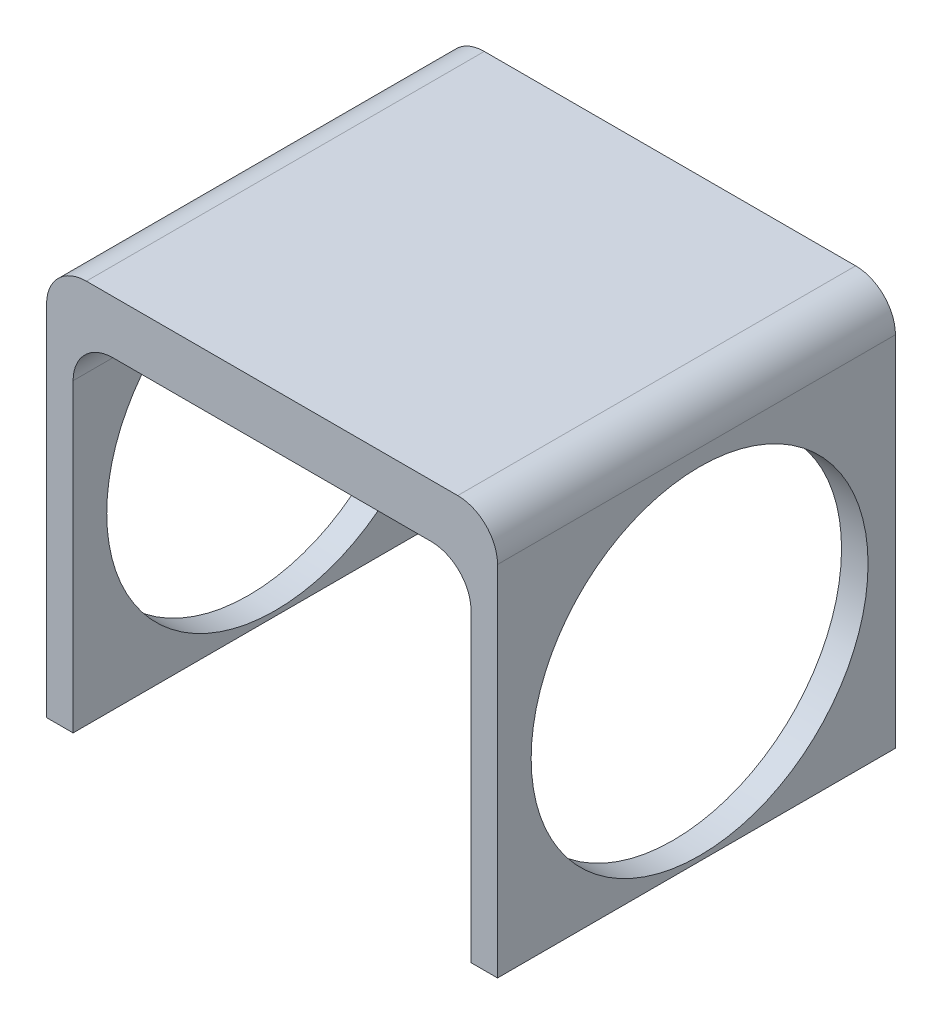
ISO-10303-21;
HEADER;
FILE_DESCRIPTION(('STEP AP214'),'2;1');
FILE_NAME('part.step','',(''),(''),'','','');
FILE_SCHEMA(('AUTOMOTIVE_DESIGN { 1 0 10303 214 1 1 1 1 }'));
ENDSEC;
DATA;
#1=APPLICATION_CONTEXT('core data for automotive mechanical design processes');
#2=APPLICATION_PROTOCOL_DEFINITION('international standard','automotive_design',2000,#1);
#3=PRODUCT_CONTEXT('',#1,'mechanical');
#4=PRODUCT('Part','Part','',(#3));
#5=PRODUCT_RELATED_PRODUCT_CATEGORY('part','',(#4));
#6=PRODUCT_DEFINITION_FORMATION('','',#4);
#7=PRODUCT_DEFINITION_CONTEXT('part definition',#1,'design');
#8=PRODUCT_DEFINITION('design','',#6,#7);
#9=PRODUCT_DEFINITION_SHAPE('','',#8);
#10=(LENGTH_UNIT() NAMED_UNIT(*) SI_UNIT(.MILLI.,.METRE.));
#11=(NAMED_UNIT(*) PLANE_ANGLE_UNIT() SI_UNIT($,.RADIAN.));
#12=(NAMED_UNIT(*) SI_UNIT($,.STERADIAN.) SOLID_ANGLE_UNIT());
#13=UNCERTAINTY_MEASURE_WITH_UNIT(LENGTH_MEASURE(1.E-05),#10,'distance_accuracy_value','');
#14=(GEOMETRIC_REPRESENTATION_CONTEXT(3) GLOBAL_UNCERTAINTY_ASSIGNED_CONTEXT((#13)) GLOBAL_UNIT_ASSIGNED_CONTEXT((#10,
#11,#12)) REPRESENTATION_CONTEXT('',''));
#15=CARTESIAN_POINT('',(0.,0.,0.));
#16=DIRECTION('',(0.,0.,1.));
#17=DIRECTION('',(1.,0.,0.));
#18=AXIS2_PLACEMENT_3D('',#15,#16,#17);
#19=CARTESIAN_POINT('',(2.00000000000001,0.,30.));
#20=DIRECTION('',(0.,1.,0.));
#21=DIRECTION('',(-1.,0.,0.));
#22=AXIS2_PLACEMENT_3D('',#19,#20,#21);
#23=PLANE('',#22);
#24=DIRECTION('',(1.,0.,0.));
#25=VECTOR('',#24,1.);
#26=CARTESIAN_POINT('',(2.00000000000001,0.,0.));
#27=LINE('',#26,#25);
#28=CARTESIAN_POINT('',(0.,0.,0.));
#29=VERTEX_POINT('',#28);
#30=CARTESIAN_POINT('',(2.00000000000001,0.,0.));
#31=VERTEX_POINT('',#30);
#32=EDGE_CURVE('E211',#29,#31,#27,.T.);
#33=ORIENTED_EDGE('',*,*,#32,.T.);
#34=DIRECTION('',(0.,0.,-1.));
#35=VECTOR('',#34,1.);
#36=CARTESIAN_POINT('',(2.00000000000001,0.,30.));
#37=LINE('',#36,#35);
#38=CARTESIAN_POINT('',(2.00000000000001,0.,30.));
#39=VERTEX_POINT('',#38);
#40=EDGE_CURVE('E46',#39,#31,#37,.T.);
#41=ORIENTED_EDGE('',*,*,#40,.F.);
#42=DIRECTION('',(1.,0.,0.));
#43=VECTOR('',#42,1.);
#44=CARTESIAN_POINT('',(2.00000000000001,0.,30.));
#45=LINE('',#44,#43);
#46=CARTESIAN_POINT('',(0.,0.,30.));
#47=VERTEX_POINT('',#46);
#48=EDGE_CURVE('E189',#47,#39,#45,.T.);
#49=ORIENTED_EDGE('',*,*,#48,.F.);
#50=DIRECTION('',(0.,0.,-1.));
#51=VECTOR('',#50,1.);
#52=CARTESIAN_POINT('',(0.,0.,30.));
#53=LINE('',#52,#51);
#54=EDGE_CURVE('E183',#47,#29,#53,.T.);
#55=ORIENTED_EDGE('',*,*,#54,.T.);
#56=EDGE_LOOP('',(#33,#41,#49,#55));
#57=FACE_BOUND('',#56,.T.);
#58=ADVANCED_FACE('F33',(#57),#23,.F.);
#59=CARTESIAN_POINT('',(2.00000000000001,23.,30.));
#60=DIRECTION('',(-1.,0.,0.));
#61=DIRECTION('',(0.,-1.,0.));
#62=AXIS2_PLACEMENT_3D('',#59,#60,#61);
#63=PLANE('',#62);
#64=DIRECTION('',(0.,0.,-1.));
#65=VECTOR('',#64,1.);
#66=CARTESIAN_POINT('',(2.00000000000001,23.,30.));
#67=LINE('',#66,#65);
#68=CARTESIAN_POINT('',(2.00000000000001,23.,6.85029164252489));
#69=VERTEX_POINT('',#68);
#70=CARTESIAN_POINT('',(2.00000000000001,23.,0.));
#71=VERTEX_POINT('',#70);
#72=EDGE_CURVE('E145',#69,#71,#67,.T.);
#73=ORIENTED_EDGE('',*,*,#72,.F.);
#74=CARTESIAN_POINT('',(2.00000000000001,13.0671288351981,14.764081532549));
#75=DIRECTION('',(-1.,0.,0.));
#76=DIRECTION('',(0.,-1.,0.));
#77=AXIS2_PLACEMENT_3D('',#74,#75,#76);
#78=CIRCLE('',#77,12.7);
#79=CARTESIAN_POINT('',(2.00000000000001,23.,22.677871422573));
#80=VERTEX_POINT('',#79);
#81=EDGE_CURVE('E59',#69,#80,#78,.T.);
#82=ORIENTED_EDGE('',*,*,#81,.T.);
#83=CARTESIAN_POINT('',(2.00000000000001,23.,30.));
#84=VERTEX_POINT('',#83);
#85=EDGE_CURVE('E142',#84,#80,#67,.T.);
#86=ORIENTED_EDGE('',*,*,#85,.F.);
#87=DIRECTION('',(0.,1.,0.));
#88=VECTOR('',#87,1.);
#89=CARTESIAN_POINT('',(2.00000000000001,23.,30.));
#90=LINE('',#89,#88);
#91=EDGE_CURVE('E232',#39,#84,#90,.T.);
#92=ORIENTED_EDGE('',*,*,#91,.F.);
#93=ORIENTED_EDGE('',*,*,#40,.T.);
#94=DIRECTION('',(0.,1.,0.));
#95=VECTOR('',#94,1.);
#96=CARTESIAN_POINT('',(2.00000000000001,23.,0.));
#97=LINE('',#96,#95);
#98=EDGE_CURVE('E209',#31,#71,#97,.T.);
#99=ORIENTED_EDGE('',*,*,#98,.T.);
#100=EDGE_LOOP('',(#73,#82,#86,#92,#93,#99));
#101=FACE_BOUND('',#100,.T.);
#102=ADVANCED_FACE('F141',(#101),#63,.F.);
#103=CARTESIAN_POINT('',(5.00000000000001,23.,30.));
#104=DIRECTION('',(0.,0.,-1.));
#105=DIRECTION('',(-1.,0.,0.));
#106=AXIS2_PLACEMENT_3D('',#103,#104,#105);
#107=CYLINDRICAL_SURFACE('',#106,3.);
#108=ORIENTED_EDGE('',*,*,#85,.T.);
#109=CARTESIAN_POINT('',(2.00000000000001,23.,22.677871422573));
#110=CARTESIAN_POINT('',(2.00000541370947,23.067660819774,22.5929508145775));
#111=CARTESIAN_POINT('',(2.00228824975899,23.1342124315426,22.5071818236274));
#112=CARTESIAN_POINT('',(2.01100593425374,23.2649785872917,22.3341284160475));
#113=CARTESIAN_POINT('',(2.01743942183496,23.3291938899851,22.2468445052349));
#114=CARTESIAN_POINT('',(2.04233021190704,23.5179632702162,21.9832704104195));
#115=CARTESIAN_POINT('',(2.06638120705584,23.6389203292734,21.8049067553971));
#116=CARTESIAN_POINT('',(2.12629637729784,23.8693926991584,21.4458567447877));
#117=CARTESIAN_POINT('',(2.16202327247059,23.9790223636098,21.2652197817096));
#118=CARTESIAN_POINT('',(2.24311014728509,24.1883419247923,20.900277368607));
#119=CARTESIAN_POINT('',(2.28847592467472,24.2880257858925,20.7159697714506));
#120=CARTESIAN_POINT('',(2.41955964060307,24.5404315655292,20.220635970013));
#121=CARTESIAN_POINT('',(2.51204433944513,24.6843190290325,19.906880173368));
#122=CARTESIAN_POINT('',(2.71011156321414,24.9450343141579,19.2722144305041));
#123=CARTESIAN_POINT('',(2.81570358651893,25.0618423344894,18.9512994360596));
#124=CARTESIAN_POINT('',(2.97802223674495,25.2174968888046,18.4637950656446));
#125=CARTESIAN_POINT('',(3.03297596879829,25.2662534070856,18.2997066956016));
#126=CARTESIAN_POINT('',(3.14281604204161,25.3571039517056,17.9696726137882));
#127=CARTESIAN_POINT('',(3.19770238706131,25.399198375879,17.8037270135584));
#128=CARTESIAN_POINT('',(3.30579983907373,25.4767121365326,17.4699225119623));
#129=CARTESIAN_POINT('',(3.35901247028151,25.5121377019628,17.3020655528821));
#130=CARTESIAN_POINT('',(3.4617718083689,25.576338238378,16.9639230194869));
#131=CARTESIAN_POINT('',(3.51131798477014,25.6051122482615,16.7936370979738));
#132=CARTESIAN_POINT('',(3.59914022209814,25.6532693497467,16.4679852743152));
#133=CARTESIAN_POINT('',(3.63805160195516,25.6733148757526,16.3128917007565));
#134=CARTESIAN_POINT('',(3.70795556076649,25.7077930055785,16.0003305089221));
#135=CARTESIAN_POINT('',(3.73895149319939,25.7222279877334,15.8428639260456));
#136=CARTESIAN_POINT('',(3.78965766094144,25.7451504597433,15.5273075021446));
#137=CARTESIAN_POINT('',(3.80948146700143,25.7536980044883,15.3692410107624));
#138=CARTESIAN_POINT('',(3.83562979397381,25.7648615009213,15.0517940326834));
#139=CARTESIAN_POINT('',(3.84195972295349,25.767479828943,14.8924140981067));
#140=CARTESIAN_POINT('',(3.84009908411382,25.766700202207,14.5729417714857));
#141=CARTESIAN_POINT('',(3.83183403067035,25.7632713859072,14.4128499081166));
#142=CARTESIAN_POINT('',(3.80197345352201,25.7504508562347,14.0941480983059));
#143=CARTESIAN_POINT('',(3.7803720283968,25.7410565030254,13.9355388394842));
#144=CARTESIAN_POINT('',(3.72641306117898,25.7164043756015,13.61895189675));
#145=CARTESIAN_POINT('',(3.69394390754744,25.7010854915638,13.4609987381131));
#146=CARTESIAN_POINT('',(3.62143054914372,25.664805459355,13.1474585177539));
#147=CARTESIAN_POINT('',(3.58138226373542,25.6438412691443,12.9918727796407));
#148=CARTESIAN_POINT('',(3.49136221588351,25.5936397086996,12.6647896279849));
#149=CARTESIAN_POINT('',(3.44077741577934,25.5637200285162,12.4935684801339));
#150=CARTESIAN_POINT('',(3.3362208086655,25.497135586202,12.153537842454));
#151=CARTESIAN_POINT('',(3.28224947790962,25.4604717711164,11.9847280175974));
#152=CARTESIAN_POINT('',(3.17287302099301,25.3803797562367,11.6490122591385));
#153=CARTESIAN_POINT('',(3.11746663037223,25.3369454091466,11.4821082051557));
#154=CARTESIAN_POINT('',(3.00680117824302,25.2433056747543,11.1501570919265));
#155=CARTESIAN_POINT('',(2.95154212921036,25.1930997315565,10.9851101863441));
#156=CARTESIAN_POINT('',(2.78867882280629,25.0330021111079,10.4949419008708));
#157=CARTESIAN_POINT('',(2.68314958082455,24.9130458544895,10.1723421122895));
#158=CARTESIAN_POINT('',(2.48610441139467,24.6455905295606,9.53449303045939));
#159=CARTESIAN_POINT('',(2.39457757472188,24.4981131038155,9.21923817881462));
#160=CARTESIAN_POINT('',(2.2681924239423,24.2441385281983,8.73045253549048));
#161=CARTESIAN_POINT('',(2.22583339710372,24.147066762278,8.55393753538349));
#162=CARTESIAN_POINT('',(2.15024706543519,23.9437534216515,8.20436403441391));
#163=CARTESIAN_POINT('',(2.1170145444787,23.8375171306215,8.0313036118073));
#164=CARTESIAN_POINT('',(2.06138412676863,23.6147085962387,7.6872887702241));
#165=CARTESIAN_POINT('',(2.03911095745659,23.498034459268,7.51637924023877));
#166=CARTESIAN_POINT('',(2.01609366641987,23.3162892809991,7.26371419599659));
#167=CARTESIAN_POINT('',(2.01015262330487,23.2545232264513,7.18003118191206));
#168=CARTESIAN_POINT('',(2.00210752670161,23.1288453771716,7.01406828546004));
#169=CARTESIAN_POINT('',(2.00000460424254,23.0649329555902,6.93178882376953));
#170=CARTESIAN_POINT('',(2.,23.,6.85029164252489));
#171=B_SPLINE_CURVE_WITH_KNOTS('',3,(#109,#110,#111,#112,#113,#114,#115,#116,#117,#118,#119,
#120,#121,#122,#123,#124,#125,#126,#127,#128,#129,#130,#131,#132,#133,#134,#135,#136,#137,#138,
#139,#140,#141,#142,#143,#144,#145,#146,#147,#148,#149,#150,#151,#152,#153,#154,#155,#156,#157,
#158,#159,#160,#161,#162,#163,#164,#165,#166,#167,#168,#169,#170),.UNSPECIFIED.,.F.,.F.,(4,2,2,
2,2,2,2,2,2,2,2,2,2,2,2,2,2,2,2,2,2,2,2,2,2,2,2,2,2,2,4),(0.,0.325659882711964,
0.651213046335516,1.30097780041144,1.94336236111868,2.58613441292052,3.65652814599402,
4.72770213109706,5.2669457057586,5.80615706673649,6.34486225881106,6.88364524128184,
7.36686610280958,7.84988190084406,8.32789466677231,8.80571581900975,9.28598258818869,
9.76646203061891,10.2520356672187,10.7378714863091,11.2807419682606,11.8235362757449,
12.3668263144587,12.9101609802423,13.9888853278751,15.0667649176397,15.6839519245499,
16.3007854492668,16.9244854679799,17.2369307571228,17.5494681037467),.UNSPECIFIED.);
#172=EDGE_CURVE('E11',#80,#69,#171,.T.);
#173=ORIENTED_EDGE('',*,*,#172,.T.);
#174=ORIENTED_EDGE('',*,*,#72,.T.);
#175=CARTESIAN_POINT('',(5.00000000000001,23.,0.));
#176=DIRECTION('',(0.,0.,-1.));
#177=DIRECTION('',(1.,0.,0.));
#178=AXIS2_PLACEMENT_3D('',#175,#176,#177);
#179=CIRCLE('',#178,3.);
#180=CARTESIAN_POINT('',(5.00000000000003,26.,0.));
#181=VERTEX_POINT('',#180);
#182=EDGE_CURVE('E207',#71,#181,#179,.T.);
#183=ORIENTED_EDGE('',*,*,#182,.T.);
#184=DIRECTION('',(0.,0.,-1.));
#185=VECTOR('',#184,1.);
#186=CARTESIAN_POINT('',(5.00000000000003,26.,30.));
#187=LINE('',#186,#185);
#188=CARTESIAN_POINT('',(5.00000000000003,26.,30.));
#189=VERTEX_POINT('',#188);
#190=EDGE_CURVE('E154',#189,#181,#187,.T.);
#191=ORIENTED_EDGE('',*,*,#190,.F.);
#192=CARTESIAN_POINT('',(5.00000000000001,23.,30.));
#193=DIRECTION('',(0.,0.,-1.));
#194=DIRECTION('',(1.,0.,0.));
#195=AXIS2_PLACEMENT_3D('',#192,#193,#194);
#196=CIRCLE('',#195,3.);
#197=EDGE_CURVE('E151',#84,#189,#196,.T.);
#198=ORIENTED_EDGE('',*,*,#197,.F.);
#199=EDGE_LOOP('',(#108,#173,#174,#183,#191,#198));
#200=FACE_BOUND('',#199,.T.);
#201=ADVANCED_FACE('F149',(#200),#107,.F.);
#202=CARTESIAN_POINT('',(29.,26.,30.));
#203=DIRECTION('',(0.,1.,0.));
#204=DIRECTION('',(-1.,0.,0.));
#205=AXIS2_PLACEMENT_3D('',#202,#203,#204);
#206=PLANE('',#205);
#207=DIRECTION('',(1.,0.,0.));
#208=VECTOR('',#207,1.);
#209=CARTESIAN_POINT('',(29.,26.,0.));
#210=LINE('',#209,#208);
#211=CARTESIAN_POINT('',(29.,26.,0.));
#212=VERTEX_POINT('',#211);
#213=EDGE_CURVE('E205',#181,#212,#210,.T.);
#214=ORIENTED_EDGE('',*,*,#213,.T.);
#215=DIRECTION('',(0.,0.,-1.));
#216=VECTOR('',#215,1.);
#217=CARTESIAN_POINT('',(29.,26.,30.));
#218=LINE('',#217,#216);
#219=CARTESIAN_POINT('',(29.,26.,30.));
#220=VERTEX_POINT('',#219);
#221=EDGE_CURVE('E158',#220,#212,#218,.T.);
#222=ORIENTED_EDGE('',*,*,#221,.F.);
#223=DIRECTION('',(1.,0.,0.));
#224=VECTOR('',#223,1.);
#225=CARTESIAN_POINT('',(29.,26.,30.));
#226=LINE('',#225,#224);
#227=EDGE_CURVE('E229',#189,#220,#226,.T.);
#228=ORIENTED_EDGE('',*,*,#227,.F.);
#229=ORIENTED_EDGE('',*,*,#190,.T.);
#230=EDGE_LOOP('',(#214,#222,#228,#229));
#231=FACE_BOUND('',#230,.T.);
#232=ADVANCED_FACE('F290',(#231),#206,.F.);
#233=CARTESIAN_POINT('',(29.,23.,30.));
#234=DIRECTION('',(0.,0.,-1.));
#235=DIRECTION('',(-1.,0.,0.));
#236=AXIS2_PLACEMENT_3D('',#233,#234,#235);
#237=CYLINDRICAL_SURFACE('',#236,3.);
#238=DIRECTION('',(0.,0.,-1.));
#239=VECTOR('',#238,1.);
#240=CARTESIAN_POINT('',(32.,23.,30.));
#241=LINE('',#240,#239);
#242=CARTESIAN_POINT('',(32.,23.,6.85029164252492));
#243=VERTEX_POINT('',#242);
#244=CARTESIAN_POINT('',(32.,23.,0.));
#245=VERTEX_POINT('',#244);
#246=EDGE_CURVE('E164',#243,#245,#241,.T.);
#247=ORIENTED_EDGE('',*,*,#246,.F.);
#248=CARTESIAN_POINT('',(32.,23.,6.85029164252492));
#249=CARTESIAN_POINT('',(31.9999945862905,23.067660819774,6.93521225052049));
#250=CARTESIAN_POINT('',(31.997711750241,23.1342124315426,7.02098124147053));
#251=CARTESIAN_POINT('',(31.9889940657463,23.2649785872918,7.19403464905041));
#252=CARTESIAN_POINT('',(31.982560578165,23.3291938899851,7.28131855986309));
#253=CARTESIAN_POINT('',(31.957669788093,23.5179632702162,7.54489265467843));
#254=CARTESIAN_POINT('',(31.9336187929442,23.6389203292735,7.72325630970086));
#255=CARTESIAN_POINT('',(31.8737036227022,23.8693926991584,8.08230632031025));
#256=CARTESIAN_POINT('',(31.8379767275294,23.9790223636098,8.26294328338841));
#257=CARTESIAN_POINT('',(31.7568898527149,24.1883419247923,8.62788569649102));
#258=CARTESIAN_POINT('',(31.7115240753253,24.2880257858925,8.81219329364738));
#259=CARTESIAN_POINT('',(31.5804403593969,24.5404315655292,9.30752709508493));
#260=CARTESIAN_POINT('',(31.4879556605549,24.6843190290325,9.62128289173));
#261=CARTESIAN_POINT('',(31.2898884367859,24.9450343141579,10.2559486345939));
#262=CARTESIAN_POINT('',(31.1842964134811,25.0618423344894,10.5768636290384));
#263=CARTESIAN_POINT('',(31.021977763255,25.2174968888046,11.0643679994534));
#264=CARTESIAN_POINT('',(30.9670240312017,25.2662534070856,11.2284563694964));
#265=CARTESIAN_POINT('',(30.8571839579584,25.3571039517057,11.5584904513098));
#266=CARTESIAN_POINT('',(30.8022976129387,25.399198375879,11.7244360515396));
#267=CARTESIAN_POINT('',(30.6942001609263,25.4767121365326,12.0582405531357));
#268=CARTESIAN_POINT('',(30.6409875297185,25.5121377019628,12.2260975122159));
#269=CARTESIAN_POINT('',(30.5382281916311,25.576338238378,12.5642400456111));
#270=CARTESIAN_POINT('',(30.4886820152299,25.6051122482615,12.7345259671242));
#271=CARTESIAN_POINT('',(30.4008597779019,25.6532693497467,13.0601777907829));
#272=CARTESIAN_POINT('',(30.3619483980448,25.6733148757526,13.2152713643415));
#273=CARTESIAN_POINT('',(30.2920444392335,25.7077930055785,13.5278325561758));
#274=CARTESIAN_POINT('',(30.2610485068006,25.7222279877334,13.6852991390524));
#275=CARTESIAN_POINT('',(30.2103423390586,25.7451504597433,14.0008555629534));
#276=CARTESIAN_POINT('',(30.1905185329986,25.7536980044883,14.1589220543356));
#277=CARTESIAN_POINT('',(30.1643702060262,25.7648615009212,14.4763690324145));
#278=CARTESIAN_POINT('',(30.1580402770465,25.767479828943,14.6357489669912));
#279=CARTESIAN_POINT('',(30.1599009158862,25.766700202207,14.9552212936122));
#280=CARTESIAN_POINT('',(30.1681659693297,25.7632713859072,15.1153131569813));
#281=CARTESIAN_POINT('',(30.198026546478,25.7504508562347,15.4340149667919));
#282=CARTESIAN_POINT('',(30.2196279716032,25.7410565030254,15.5926242256136));
#283=CARTESIAN_POINT('',(30.273586938821,25.7164043756015,15.9092111683478));
#284=CARTESIAN_POINT('',(30.3060560924526,25.7010854915638,16.0671643269847));
#285=CARTESIAN_POINT('',(30.3785694508563,25.664805459355,16.3807045473439));
#286=CARTESIAN_POINT('',(30.4186177362646,25.6438412691443,16.5362902854571));
#287=CARTESIAN_POINT('',(30.5086377841165,25.5936397086997,16.8633734371128));
#288=CARTESIAN_POINT('',(30.5592225842206,25.5637200285162,17.0345945849639));
#289=CARTESIAN_POINT('',(30.6637791913345,25.4971355862021,17.3746252226438));
#290=CARTESIAN_POINT('',(30.7177505220904,25.4604717711165,17.5434350475003));
#291=CARTESIAN_POINT('',(30.827126979007,25.3803797562367,17.8791508059593));
#292=CARTESIAN_POINT('',(30.8825333696277,25.3369454091466,18.0460548599421));
#293=CARTESIAN_POINT('',(30.9931988217569,25.2433056747543,18.3780059731712));
#294=CARTESIAN_POINT('',(31.0484578707896,25.1930997315566,18.5430528787536));
#295=CARTESIAN_POINT('',(31.2113211771937,25.033002111108,19.0332211642269));
#296=CARTESIAN_POINT('',(31.3168504191754,24.9130458544896,19.3558209528083));
#297=CARTESIAN_POINT('',(31.5138955886053,24.6455905295606,19.9936700346384));
#298=CARTESIAN_POINT('',(31.6054224252781,24.4981131038155,20.3089248862831));
#299=CARTESIAN_POINT('',(31.7318075760577,24.2441385281984,20.7977105296073));
#300=CARTESIAN_POINT('',(31.7741666028963,24.1470667622781,20.9742255297143));
#301=CARTESIAN_POINT('',(31.8497529345648,23.9437534216516,21.3237990306839));
#302=CARTESIAN_POINT('',(31.8829854555213,23.8375171306215,21.4968594532905));
#303=CARTESIAN_POINT('',(31.9386158732314,23.6147085962388,21.8408742948737));
#304=CARTESIAN_POINT('',(31.9608890425434,23.4980344592681,22.0117838248591));
#305=CARTESIAN_POINT('',(31.9839063335801,23.3162892809992,22.2644488691013));
#306=CARTESIAN_POINT('',(31.9898473766951,23.2545232264514,22.3481318831858));
#307=CARTESIAN_POINT('',(31.9978924732984,23.1288453771716,22.5140947796378));
#308=CARTESIAN_POINT('',(31.9999953957575,23.0649329555902,22.5963742413283));
#309=CARTESIAN_POINT('',(32.,23.,22.677871422573));
#310=B_SPLINE_CURVE_WITH_KNOTS('',3,(#248,#249,#250,#251,#252,#253,#254,#255,#256,#257,#258,
#259,#260,#261,#262,#263,#264,#265,#266,#267,#268,#269,#270,#271,#272,#273,#274,#275,#276,#277,
#278,#279,#280,#281,#282,#283,#284,#285,#286,#287,#288,#289,#290,#291,#292,#293,#294,#295,#296,
#297,#298,#299,#300,#301,#302,#303,#304,#305,#306,#307,#308,#309),.UNSPECIFIED.,.F.,.F.,(4,2,2,
2,2,2,2,2,2,2,2,2,2,2,2,2,2,2,2,2,2,2,2,2,2,2,2,2,2,2,4),(0.,0.325659882711964,
0.651213046335519,1.30097780041145,1.9433623611187,2.58613441292054,3.65652814599405,
4.7277021310971,5.26694570575864,5.80615706673655,6.34486225881112,6.88364524128191,
7.36686610280962,7.84988190084407,8.32789466677229,8.80571581900969,9.2859825881886,
9.76646203061879,10.2520356672185,10.7378714863089,11.2807419682605,11.8235362757447,
12.3668263144585,12.9101609802421,13.9888853278749,15.0667649176394,15.6839519245496,
16.3007854492666,16.9244854679798,17.2369307571227,17.5494681037466),.UNSPECIFIED.);
#311=CARTESIAN_POINT('',(32.,23.,22.677871422573));
#312=VERTEX_POINT('',#311);
#313=EDGE_CURVE('E146',#243,#312,#310,.T.);
#314=ORIENTED_EDGE('',*,*,#313,.T.);
#315=CARTESIAN_POINT('',(32.,23.,30.));
#316=VERTEX_POINT('',#315);
#317=EDGE_CURVE('E161',#316,#312,#241,.T.);
#318=ORIENTED_EDGE('',*,*,#317,.F.);
#319=CARTESIAN_POINT('',(29.,23.,30.));
#320=DIRECTION('',(0.,0.,-1.));
#321=DIRECTION('',(1.,0.,0.));
#322=AXIS2_PLACEMENT_3D('',#319,#320,#321);
#323=CIRCLE('',#322,3.);
#324=EDGE_CURVE('E227',#220,#316,#323,.T.);
#325=ORIENTED_EDGE('',*,*,#324,.F.);
#326=ORIENTED_EDGE('',*,*,#221,.T.);
#327=CARTESIAN_POINT('',(29.,23.,0.));
#328=DIRECTION('',(0.,0.,-1.));
#329=DIRECTION('',(1.,0.,0.));
#330=AXIS2_PLACEMENT_3D('',#327,#328,#329);
#331=CIRCLE('',#330,3.);
#332=EDGE_CURVE('E202',#212,#245,#331,.T.);
#333=ORIENTED_EDGE('',*,*,#332,.T.);
#334=EDGE_LOOP('',(#247,#314,#318,#325,#326,#333));
#335=FACE_BOUND('',#334,.T.);
#336=ADVANCED_FACE('F243',(#335),#237,.F.);
#337=CARTESIAN_POINT('',(32.,0.,30.));
#338=DIRECTION('',(1.,0.,0.));
#339=DIRECTION('',(0.,0.,-1.));
#340=AXIS2_PLACEMENT_3D('',#337,#338,#339);
#341=PLANE('',#340);
#342=ORIENTED_EDGE('',*,*,#317,.T.);
#343=CARTESIAN_POINT('',(32.,13.0671288351981,14.764081532549));
#344=DIRECTION('',(1.,0.,0.));
#345=DIRECTION('',(0.,0.,-1.));
#346=AXIS2_PLACEMENT_3D('',#343,#344,#345);
#347=CIRCLE('',#346,12.7);
#348=EDGE_CURVE('E52',#312,#243,#347,.T.);
#349=ORIENTED_EDGE('',*,*,#348,.T.);
#350=ORIENTED_EDGE('',*,*,#246,.T.);
#351=DIRECTION('',(0.,-1.,0.));
#352=VECTOR('',#351,1.);
#353=CARTESIAN_POINT('',(32.,0.,0.));
#354=LINE('',#353,#352);
#355=CARTESIAN_POINT('',(32.,0.,0.));
#356=VERTEX_POINT('',#355);
#357=EDGE_CURVE('E200',#245,#356,#354,.T.);
#358=ORIENTED_EDGE('',*,*,#357,.T.);
#359=DIRECTION('',(0.,0.,-1.));
#360=VECTOR('',#359,1.);
#361=CARTESIAN_POINT('',(32.,0.,30.));
#362=LINE('',#361,#360);
#363=CARTESIAN_POINT('',(32.,0.,30.));
#364=VERTEX_POINT('',#363);
#365=EDGE_CURVE('E165',#364,#356,#362,.T.);
#366=ORIENTED_EDGE('',*,*,#365,.F.);
#367=DIRECTION('',(0.,-1.,0.));
#368=VECTOR('',#367,1.);
#369=CARTESIAN_POINT('',(32.,0.,30.));
#370=LINE('',#369,#368);
#371=EDGE_CURVE('E225',#316,#364,#370,.T.);
#372=ORIENTED_EDGE('',*,*,#371,.F.);
#373=EDGE_LOOP('',(#342,#349,#350,#358,#366,#372));
#374=FACE_BOUND('',#373,.T.);
#375=ADVANCED_FACE('F283',(#374),#341,.F.);
#376=CARTESIAN_POINT('',(34.,0.,30.));
#377=DIRECTION('',(0.,1.,0.));
#378=DIRECTION('',(-1.,0.,0.));
#379=AXIS2_PLACEMENT_3D('',#376,#377,#378);
#380=PLANE('',#379);
#381=DIRECTION('',(1.,0.,0.));
#382=VECTOR('',#381,1.);
#383=CARTESIAN_POINT('',(34.,0.,0.));
#384=LINE('',#383,#382);
#385=CARTESIAN_POINT('',(34.,0.,0.));
#386=VERTEX_POINT('',#385);
#387=EDGE_CURVE('E198',#356,#386,#384,.T.);
#388=ORIENTED_EDGE('',*,*,#387,.T.);
#389=DIRECTION('',(0.,0.,-1.));
#390=VECTOR('',#389,1.);
#391=CARTESIAN_POINT('',(34.,0.,30.));
#392=LINE('',#391,#390);
#393=CARTESIAN_POINT('',(34.,0.,30.));
#394=VERTEX_POINT('',#393);
#395=EDGE_CURVE('E168',#394,#386,#392,.T.);
#396=ORIENTED_EDGE('',*,*,#395,.F.);
#397=DIRECTION('',(1.,0.,0.));
#398=VECTOR('',#397,1.);
#399=CARTESIAN_POINT('',(34.,0.,30.));
#400=LINE('',#399,#398);
#401=EDGE_CURVE('E223',#364,#394,#400,.T.);
#402=ORIENTED_EDGE('',*,*,#401,.F.);
#403=ORIENTED_EDGE('',*,*,#365,.T.);
#404=EDGE_LOOP('',(#388,#396,#402,#403));
#405=FACE_BOUND('',#404,.T.);
#406=ADVANCED_FACE('F280',(#405),#380,.F.);
#407=CARTESIAN_POINT('',(34.,27.,30.));
#408=DIRECTION('',(-1.,0.,0.));
#409=DIRECTION('',(0.,0.,1.));
#410=AXIS2_PLACEMENT_3D('',#407,#408,#409);
#411=PLANE('',#410);
#412=CARTESIAN_POINT('',(34.,13.0671288351981,14.764081532549));
#413=DIRECTION('',(-1.,0.,0.));
#414=DIRECTION('',(0.,0.,1.));
#415=AXIS2_PLACEMENT_3D('',#412,#413,#414);
#416=CIRCLE('',#415,12.7);
#417=CARTESIAN_POINT('',(34.,13.0671288351981,27.4640815325489));
#418=VERTEX_POINT('',#417);
#419=EDGE_CURVE('E147',#418,#418,#416,.T.);
#420=ORIENTED_EDGE('',*,*,#419,.T.);
#421=EDGE_LOOP('',(#420));
#422=FACE_BOUND('',#421,.T.);
#423=DIRECTION('',(0.,1.,0.));
#424=VECTOR('',#423,1.);
#425=CARTESIAN_POINT('',(34.,27.,0.));
#426=LINE('',#425,#424);
#427=CARTESIAN_POINT('',(34.,27.,0.));
#428=VERTEX_POINT('',#427);
#429=EDGE_CURVE('E196',#386,#428,#426,.T.);
#430=ORIENTED_EDGE('',*,*,#429,.T.);
#431=DIRECTION('',(0.,0.,-1.));
#432=VECTOR('',#431,1.);
#433=CARTESIAN_POINT('',(34.,27.,30.));
#434=LINE('',#433,#432);
#435=CARTESIAN_POINT('',(34.,27.,30.));
#436=VERTEX_POINT('',#435);
#437=EDGE_CURVE('E171',#436,#428,#434,.T.);
#438=ORIENTED_EDGE('',*,*,#437,.F.);
#439=DIRECTION('',(0.,1.,0.));
#440=VECTOR('',#439,1.);
#441=CARTESIAN_POINT('',(34.,27.,30.));
#442=LINE('',#441,#440);
#443=EDGE_CURVE('E221',#394,#436,#442,.T.);
#444=ORIENTED_EDGE('',*,*,#443,.F.);
#445=ORIENTED_EDGE('',*,*,#395,.T.);
#446=EDGE_LOOP('',(#430,#438,#444,#445));
#447=FACE_BOUND('',#446,.T.);
#448=ADVANCED_FACE('F276',(#422,#447),#411,.F.);
#449=CARTESIAN_POINT('',(31.,27.,30.));
#450=DIRECTION('',(0.,0.,-1.));
#451=DIRECTION('',(-1.,0.,0.));
#452=AXIS2_PLACEMENT_3D('',#449,#450,#451);
#453=CYLINDRICAL_SURFACE('',#452,3.);
#454=CARTESIAN_POINT('',(31.,27.,0.));
#455=DIRECTION('',(0.,0.,1.));
#456=DIRECTION('',(-1.,0.,0.));
#457=AXIS2_PLACEMENT_3D('',#454,#455,#456);
#458=CIRCLE('',#457,3.);
#459=CARTESIAN_POINT('',(31.,30.,0.));
#460=VERTEX_POINT('',#459);
#461=EDGE_CURVE('E194',#428,#460,#458,.T.);
#462=ORIENTED_EDGE('',*,*,#461,.T.);
#463=DIRECTION('',(0.,0.,-1.));
#464=VECTOR('',#463,1.);
#465=CARTESIAN_POINT('',(31.,30.,30.));
#466=LINE('',#465,#464);
#467=CARTESIAN_POINT('',(31.,30.,30.));
#468=VERTEX_POINT('',#467);
#469=EDGE_CURVE('E174',#468,#460,#466,.T.);
#470=ORIENTED_EDGE('',*,*,#469,.F.);
#471=CARTESIAN_POINT('',(31.,27.,30.));
#472=DIRECTION('',(0.,0.,1.));
#473=DIRECTION('',(-1.,0.,0.));
#474=AXIS2_PLACEMENT_3D('',#471,#472,#473);
#475=CIRCLE('',#474,3.);
#476=EDGE_CURVE('E219',#436,#468,#475,.T.);
#477=ORIENTED_EDGE('',*,*,#476,.F.);
#478=ORIENTED_EDGE('',*,*,#437,.T.);
#479=EDGE_LOOP('',(#462,#470,#477,#478));
#480=FACE_BOUND('',#479,.T.);
#481=ADVANCED_FACE('F272',(#480),#453,.T.);
#482=CARTESIAN_POINT('',(3.00000000000002,30.,30.));
#483=DIRECTION('',(0.,-1.,0.));
#484=DIRECTION('',(1.,0.,0.));
#485=AXIS2_PLACEMENT_3D('',#482,#483,#484);
#486=PLANE('',#485);
#487=DIRECTION('',(-1.,0.,0.));
#488=VECTOR('',#487,1.);
#489=CARTESIAN_POINT('',(3.00000000000002,30.,0.));
#490=LINE('',#489,#488);
#491=CARTESIAN_POINT('',(3.00000000000002,30.,0.));
#492=VERTEX_POINT('',#491);
#493=EDGE_CURVE('E192',#460,#492,#490,.T.);
#494=ORIENTED_EDGE('',*,*,#493,.T.);
#495=DIRECTION('',(0.,0.,-1.));
#496=VECTOR('',#495,1.);
#497=CARTESIAN_POINT('',(3.00000000000002,30.,30.));
#498=LINE('',#497,#496);
#499=CARTESIAN_POINT('',(3.00000000000002,30.,30.));
#500=VERTEX_POINT('',#499);
#501=EDGE_CURVE('E177',#500,#492,#498,.T.);
#502=ORIENTED_EDGE('',*,*,#501,.F.);
#503=DIRECTION('',(-1.,0.,0.));
#504=VECTOR('',#503,1.);
#505=CARTESIAN_POINT('',(3.00000000000002,30.,30.));
#506=LINE('',#505,#504);
#507=EDGE_CURVE('E217',#468,#500,#506,.T.);
#508=ORIENTED_EDGE('',*,*,#507,.F.);
#509=ORIENTED_EDGE('',*,*,#469,.T.);
#510=EDGE_LOOP('',(#494,#502,#508,#509));
#511=FACE_BOUND('',#510,.T.);
#512=ADVANCED_FACE('F268',(#511),#486,.F.);
#513=CARTESIAN_POINT('',(3.,27.,30.));
#514=DIRECTION('',(0.,0.,-1.));
#515=DIRECTION('',(-1.,0.,0.));
#516=AXIS2_PLACEMENT_3D('',#513,#514,#515);
#517=CYLINDRICAL_SURFACE('',#516,3.);
#518=CARTESIAN_POINT('',(3.,27.,0.));
#519=DIRECTION('',(0.,0.,1.));
#520=DIRECTION('',(-1.,0.,0.));
#521=AXIS2_PLACEMENT_3D('',#518,#519,#520);
#522=CIRCLE('',#521,3.);
#523=CARTESIAN_POINT('',(0.,27.,0.));
#524=VERTEX_POINT('',#523);
#525=EDGE_CURVE('E190',#492,#524,#522,.T.);
#526=ORIENTED_EDGE('',*,*,#525,.T.);
#527=DIRECTION('',(0.,0.,-1.));
#528=VECTOR('',#527,1.);
#529=CARTESIAN_POINT('',(0.,27.,30.));
#530=LINE('',#529,#528);
#531=CARTESIAN_POINT('',(0.,27.,30.));
#532=VERTEX_POINT('',#531);
#533=EDGE_CURVE('E180',#532,#524,#530,.T.);
#534=ORIENTED_EDGE('',*,*,#533,.F.);
#535=CARTESIAN_POINT('',(3.,27.,30.));
#536=DIRECTION('',(0.,0.,1.));
#537=DIRECTION('',(-1.,0.,0.));
#538=AXIS2_PLACEMENT_3D('',#535,#536,#537);
#539=CIRCLE('',#538,3.);
#540=EDGE_CURVE('E215',#500,#532,#539,.T.);
#541=ORIENTED_EDGE('',*,*,#540,.F.);
#542=ORIENTED_EDGE('',*,*,#501,.T.);
#543=EDGE_LOOP('',(#526,#534,#541,#542));
#544=FACE_BOUND('',#543,.T.);
#545=ADVANCED_FACE('F264',(#544),#517,.T.);
#546=CARTESIAN_POINT('',(0.,0.,30.));
#547=DIRECTION('',(1.,0.,0.));
#548=DIRECTION('',(0.,0.,-1.));
#549=AXIS2_PLACEMENT_3D('',#546,#547,#548);
#550=PLANE('',#549);
#551=CARTESIAN_POINT('',(0.,13.0671288351981,14.764081532549));
#552=DIRECTION('',(-1.,0.,0.));
#553=DIRECTION('',(0.,0.,1.));
#554=AXIS2_PLACEMENT_3D('',#551,#552,#553);
#555=CIRCLE('',#554,12.7);
#556=CARTESIAN_POINT('',(0.,13.0671288351981,27.4640815325489));
#557=VERTEX_POINT('',#556);
#558=EDGE_CURVE('E430',#557,#557,#555,.T.);
#559=ORIENTED_EDGE('',*,*,#558,.F.);
#560=EDGE_LOOP('',(#559));
#561=FACE_BOUND('',#560,.T.);
#562=DIRECTION('',(0.,-1.,0.));
#563=VECTOR('',#562,1.);
#564=CARTESIAN_POINT('',(0.,0.,0.));
#565=LINE('',#564,#563);
#566=EDGE_CURVE('E187',#524,#29,#565,.T.);
#567=ORIENTED_EDGE('',*,*,#566,.T.);
#568=ORIENTED_EDGE('',*,*,#54,.F.);
#569=DIRECTION('',(0.,-1.,0.));
#570=VECTOR('',#569,1.);
#571=CARTESIAN_POINT('',(0.,0.,30.));
#572=LINE('',#571,#570);
#573=EDGE_CURVE('E186',#532,#47,#572,.T.);
#574=ORIENTED_EDGE('',*,*,#573,.F.);
#575=ORIENTED_EDGE('',*,*,#533,.T.);
#576=EDGE_LOOP('',(#567,#568,#574,#575));
#577=FACE_BOUND('',#576,.T.);
#578=ADVANCED_FACE('F257',(#561,#577),#550,.F.);
#579=CARTESIAN_POINT('',(3.,27.,30.));
#580=DIRECTION('',(0.,0.,-1.));
#581=DIRECTION('',(-1.,0.,0.));
#582=AXIS2_PLACEMENT_3D('',#579,#580,#581);
#583=PLANE('',#582);
#584=ORIENTED_EDGE('',*,*,#48,.T.);
#585=ORIENTED_EDGE('',*,*,#91,.T.);
#586=ORIENTED_EDGE('',*,*,#197,.T.);
#587=ORIENTED_EDGE('',*,*,#227,.T.);
#588=ORIENTED_EDGE('',*,*,#324,.T.);
#589=ORIENTED_EDGE('',*,*,#371,.T.);
#590=ORIENTED_EDGE('',*,*,#401,.T.);
#591=ORIENTED_EDGE('',*,*,#443,.T.);
#592=ORIENTED_EDGE('',*,*,#476,.T.);
#593=ORIENTED_EDGE('',*,*,#507,.T.);
#594=ORIENTED_EDGE('',*,*,#540,.T.);
#595=ORIENTED_EDGE('',*,*,#573,.T.);
#596=EDGE_LOOP('',(#584,#585,#586,#587,#588,#589,#590,#591,#592,#593,#594,#595));
#597=FACE_BOUND('',#596,.T.);
#598=ADVANCED_FACE('F252',(#597),#583,.F.);
#599=CARTESIAN_POINT('',(3.,27.,0.));
#600=DIRECTION('',(0.,0.,-1.));
#601=DIRECTION('',(-1.,0.,0.));
#602=AXIS2_PLACEMENT_3D('',#599,#600,#601);
#603=PLANE('',#602);
#604=ORIENTED_EDGE('',*,*,#32,.F.);
#605=ORIENTED_EDGE('',*,*,#566,.F.);
#606=ORIENTED_EDGE('',*,*,#525,.F.);
#607=ORIENTED_EDGE('',*,*,#493,.F.);
#608=ORIENTED_EDGE('',*,*,#461,.F.);
#609=ORIENTED_EDGE('',*,*,#429,.F.);
#610=ORIENTED_EDGE('',*,*,#387,.F.);
#611=ORIENTED_EDGE('',*,*,#357,.F.);
#612=ORIENTED_EDGE('',*,*,#332,.F.);
#613=ORIENTED_EDGE('',*,*,#213,.F.);
#614=ORIENTED_EDGE('',*,*,#182,.F.);
#615=ORIENTED_EDGE('',*,*,#98,.F.);
#616=EDGE_LOOP('',(#604,#605,#606,#607,#608,#609,#610,#611,#612,#613,#614,#615));
#617=FACE_BOUND('',#616,.T.);
#618=ADVANCED_FACE('F256',(#617),#603,.T.);
#619=CARTESIAN_POINT('',(0.,13.0671288351981,14.764081532549));
#620=DIRECTION('',(-1.,0.,0.));
#621=DIRECTION('',(0.,0.,1.));
#622=AXIS2_PLACEMENT_3D('',#619,#620,#621);
#623=CYLINDRICAL_SURFACE('',#622,12.7);
#624=ORIENTED_EDGE('',*,*,#558,.T.);
#625=EDGE_LOOP('',(#624));
#626=FACE_BOUND('',#625,.T.);
#627=ORIENTED_EDGE('',*,*,#172,.F.);
#628=ORIENTED_EDGE('',*,*,#81,.F.);
#629=EDGE_LOOP('',(#627,#628));
#630=FACE_BOUND('',#629,.T.);
#631=ADVANCED_FACE('F135',(#626,#630),#623,.F.);
#632=ORIENTED_EDGE('',*,*,#419,.F.);
#633=EDGE_LOOP('',(#632));
#634=FACE_BOUND('',#633,.T.);
#635=ORIENTED_EDGE('',*,*,#313,.F.);
#636=ORIENTED_EDGE('',*,*,#348,.F.);
#637=EDGE_LOOP('',(#635,#636));
#638=FACE_BOUND('',#637,.T.);
#639=ADVANCED_FACE('F247',(#634,#638),#623,.F.);
#640=CLOSED_SHELL('',(#58,#102,#201,#232,#336,#375,#406,#448,#481,#512,#545,#578,#598,#618,#631,#639));
#641=MANIFOLD_SOLID_BREP('B2',#640);
#642=ADVANCED_BREP_SHAPE_REPRESENTATION('',(#18,#641),#14);
#643=SHAPE_DEFINITION_REPRESENTATION(#9,#642);
ENDSEC;
END-ISO-10303-21;
